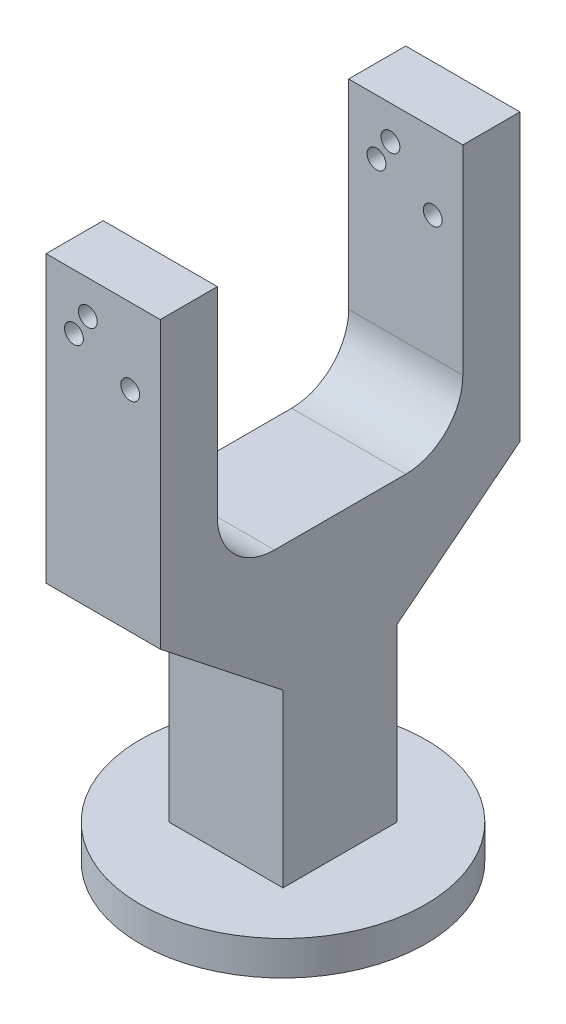
ISO-10303-21;
HEADER;
FILE_DESCRIPTION(('STEP AP214'),'2;1');
FILE_NAME('part.step','',(''),(''),'','','');
FILE_SCHEMA(('AUTOMOTIVE_DESIGN { 1 0 10303 214 1 1 1 1 }'));
ENDSEC;
DATA;
#1=APPLICATION_CONTEXT('core data for automotive mechanical design processes');
#2=APPLICATION_PROTOCOL_DEFINITION('international standard','automotive_design',2000,#1);
#3=PRODUCT_CONTEXT('',#1,'mechanical');
#4=PRODUCT('Part','Part','',(#3));
#5=PRODUCT_RELATED_PRODUCT_CATEGORY('part','',(#4));
#6=PRODUCT_DEFINITION_FORMATION('','',#4);
#7=PRODUCT_DEFINITION_CONTEXT('part definition',#1,'design');
#8=PRODUCT_DEFINITION('design','',#6,#7);
#9=PRODUCT_DEFINITION_SHAPE('','',#8);
#10=(LENGTH_UNIT() NAMED_UNIT(*) SI_UNIT(.MILLI.,.METRE.));
#11=(NAMED_UNIT(*) PLANE_ANGLE_UNIT() SI_UNIT($,.RADIAN.));
#12=(NAMED_UNIT(*) SI_UNIT($,.STERADIAN.) SOLID_ANGLE_UNIT());
#13=UNCERTAINTY_MEASURE_WITH_UNIT(LENGTH_MEASURE(1.E-05),#10,'distance_accuracy_value','');
#14=(GEOMETRIC_REPRESENTATION_CONTEXT(3) GLOBAL_UNCERTAINTY_ASSIGNED_CONTEXT((#13)) GLOBAL_UNIT_ASSIGNED_CONTEXT((#10,
#11,#12)) REPRESENTATION_CONTEXT('',''));
#15=CARTESIAN_POINT('',(0.,0.,0.));
#16=DIRECTION('',(0.,0.,1.));
#17=DIRECTION('',(1.,0.,0.));
#18=AXIS2_PLACEMENT_3D('',#15,#16,#17);
#19=CARTESIAN_POINT('',(0.,6.,0.));
#20=DIRECTION('',(0.,-1.,0.));
#21=DIRECTION('',(0.,0.,-1.));
#22=AXIS2_PLACEMENT_3D('',#19,#20,#21);
#23=CYLINDRICAL_SURFACE('',#22,25.);
#24=CARTESIAN_POINT('',(0.,6.,0.));
#25=DIRECTION('',(0.,1.,0.));
#26=DIRECTION('',(0.,0.,1.));
#27=AXIS2_PLACEMENT_3D('',#24,#25,#26);
#28=CIRCLE('',#27,25.);
#29=CARTESIAN_POINT('',(0.,6.,25.));
#30=VERTEX_POINT('',#29);
#31=EDGE_CURVE('E285',#30,#30,#28,.T.);
#32=ORIENTED_EDGE('',*,*,#31,.F.);
#33=EDGE_LOOP('',(#32));
#34=FACE_BOUND('',#33,.T.);
#35=CARTESIAN_POINT('',(0.,0.,0.));
#36=DIRECTION('',(0.,1.,0.));
#37=DIRECTION('',(0.,0.,1.));
#38=AXIS2_PLACEMENT_3D('',#35,#36,#37);
#39=CIRCLE('',#38,25.);
#40=CARTESIAN_POINT('',(0.,0.,25.));
#41=VERTEX_POINT('',#40);
#42=EDGE_CURVE('E284',#41,#41,#39,.T.);
#43=ORIENTED_EDGE('',*,*,#42,.T.);
#44=EDGE_LOOP('',(#43));
#45=FACE_BOUND('',#44,.T.);
#46=ADVANCED_FACE('F45',(#34,#45),#23,.T.);
#47=CARTESIAN_POINT('',(0.,6.,0.));
#48=DIRECTION('',(0.,1.,0.));
#49=DIRECTION('',(0.,0.,1.));
#50=AXIS2_PLACEMENT_3D('',#47,#48,#49);
#51=PLANE('',#50);
#52=DIRECTION('',(0.,0.,-1.));
#53=VECTOR('',#52,1.);
#54=CARTESIAN_POINT('',(10.,6.,-10.));
#55=LINE('',#54,#53);
#56=CARTESIAN_POINT('',(10.,6.,10.));
#57=VERTEX_POINT('',#56);
#58=CARTESIAN_POINT('',(10.,6.,-10.));
#59=VERTEX_POINT('',#58);
#60=EDGE_CURVE('E243',#57,#59,#55,.T.);
#61=ORIENTED_EDGE('',*,*,#60,.F.);
#62=DIRECTION('',(1.,0.,0.));
#63=VECTOR('',#62,1.);
#64=CARTESIAN_POINT('',(-10.,6.,10.));
#65=LINE('',#64,#63);
#66=CARTESIAN_POINT('',(-10.,6.,10.));
#67=VERTEX_POINT('',#66);
#68=EDGE_CURVE('E152',#67,#57,#65,.T.);
#69=ORIENTED_EDGE('',*,*,#68,.F.);
#70=DIRECTION('',(0.,0.,1.));
#71=VECTOR('',#70,1.);
#72=CARTESIAN_POINT('',(-10.,6.,-10.));
#73=LINE('',#72,#71);
#74=CARTESIAN_POINT('',(-10.,6.,-10.));
#75=VERTEX_POINT('',#74);
#76=EDGE_CURVE('E268',#75,#67,#73,.T.);
#77=ORIENTED_EDGE('',*,*,#76,.F.);
#78=DIRECTION('',(-1.,0.,0.));
#79=VECTOR('',#78,1.);
#80=CARTESIAN_POINT('',(-10.,6.,-10.));
#81=LINE('',#80,#79);
#82=EDGE_CURVE('E264',#59,#75,#81,.T.);
#83=ORIENTED_EDGE('',*,*,#82,.F.);
#84=EDGE_LOOP('',(#61,#69,#77,#83));
#85=FACE_BOUND('',#84,.T.);
#86=ORIENTED_EDGE('',*,*,#31,.T.);
#87=EDGE_LOOP('',(#86));
#88=FACE_BOUND('',#87,.T.);
#89=ADVANCED_FACE('F338',(#85,#88),#51,.T.);
#90=CARTESIAN_POINT('',(0.,0.,0.));
#91=DIRECTION('',(0.,1.,0.));
#92=DIRECTION('',(0.,0.,1.));
#93=AXIS2_PLACEMENT_3D('',#90,#91,#92);
#94=PLANE('',#93);
#95=CARTESIAN_POINT('',(0.,0.,0.));
#96=DIRECTION('',(0.,-1.,0.));
#97=DIRECTION('',(0.,0.,-1.));
#98=AXIS2_PLACEMENT_3D('',#95,#96,#97);
#99=CIRCLE('',#98,11.1);
#100=CARTESIAN_POINT('',(0.,0.,-11.1));
#101=VERTEX_POINT('',#100);
#102=EDGE_CURVE('E184',#101,#101,#99,.T.);
#103=ORIENTED_EDGE('',*,*,#102,.F.);
#104=EDGE_LOOP('',(#103));
#105=FACE_BOUND('',#104,.T.);
#106=ORIENTED_EDGE('',*,*,#42,.F.);
#107=EDGE_LOOP('',(#106));
#108=FACE_BOUND('',#107,.T.);
#109=ADVANCED_FACE('F344',(#105,#108),#94,.F.);
#110=CARTESIAN_POINT('',(10.,36.,-10.));
#111=DIRECTION('',(-1.,0.,0.));
#112=DIRECTION('',(0.,0.,1.));
#113=AXIS2_PLACEMENT_3D('',#110,#111,#112);
#114=PLANE('',#113);
#115=ORIENTED_EDGE('',*,*,#60,.T.);
#116=DIRECTION('',(0.,-1.,0.));
#117=VECTOR('',#116,1.);
#118=CARTESIAN_POINT('',(10.,36.,-10.));
#119=LINE('',#118,#117);
#120=CARTESIAN_POINT('',(10.,36.,-10.));
#121=VERTEX_POINT('',#120);
#122=EDGE_CURVE('E280',#121,#59,#119,.T.);
#123=ORIENTED_EDGE('',*,*,#122,.F.);
#124=DIRECTION('',(0.,-0.619466445273104,0.785023135442965));
#125=VECTOR('',#124,1.);
#126=CARTESIAN_POINT('',(10.,36.,-10.));
#127=LINE('',#126,#125);
#128=CARTESIAN_POINT('',(9.99999999999999,52.9657784236594,-31.5));
#129=VERTEX_POINT('',#128);
#130=EDGE_CURVE('E208',#129,#121,#127,.T.);
#131=ORIENTED_EDGE('',*,*,#130,.F.);
#132=DIRECTION('',(0.,-1.,0.));
#133=VECTOR('',#132,1.);
#134=CARTESIAN_POINT('',(9.99999999999999,52.9657784236594,-31.5));
#135=LINE('',#134,#133);
#136=CARTESIAN_POINT('',(9.99999999999999,102.965778423659,-31.5));
#137=VERTEX_POINT('',#136);
#138=EDGE_CURVE('E204',#137,#129,#135,.T.);
#139=ORIENTED_EDGE('',*,*,#138,.F.);
#140=DIRECTION('',(0.,0.,-1.));
#141=VECTOR('',#140,1.);
#142=CARTESIAN_POINT('',(9.99999999999999,102.965778423659,-31.5));
#143=LINE('',#142,#141);
#144=CARTESIAN_POINT('',(10.,102.965778423659,-21.5));
#145=VERTEX_POINT('',#144);
#146=EDGE_CURVE('E200',#145,#137,#143,.T.);
#147=ORIENTED_EDGE('',*,*,#146,.F.);
#148=DIRECTION('',(0.,1.,0.));
#149=VECTOR('',#148,1.);
#150=CARTESIAN_POINT('',(10.,102.965778423659,-21.5));
#151=LINE('',#150,#149);
#152=CARTESIAN_POINT('',(10.,68.0112471202483,-21.5));
#153=VERTEX_POINT('',#152);
#154=EDGE_CURVE('E197',#153,#145,#151,.T.);
#155=ORIENTED_EDGE('',*,*,#154,.F.);
#156=CARTESIAN_POINT('',(10.,68.0112471202483,-11.5));
#157=DIRECTION('',(-1.,0.,0.));
#158=DIRECTION('',(0.,0.,1.));
#159=AXIS2_PLACEMENT_3D('',#156,#157,#158);
#160=CIRCLE('',#159,10.);
#161=CARTESIAN_POINT('',(10.,58.0112471202483,-11.5));
#162=VERTEX_POINT('',#161);
#163=EDGE_CURVE('E302',#153,#162,#160,.T.);
#164=ORIENTED_EDGE('',*,*,#163,.T.);
#165=DIRECTION('',(0.,0.,-1.));
#166=VECTOR('',#165,1.);
#167=CARTESIAN_POINT('',(10.,58.0112471202483,-21.5));
#168=LINE('',#167,#166);
#169=CARTESIAN_POINT('',(10.,58.0112471202483,11.5));
#170=VERTEX_POINT('',#169);
#171=EDGE_CURVE('E194',#170,#162,#168,.T.);
#172=ORIENTED_EDGE('',*,*,#171,.F.);
#173=CARTESIAN_POINT('',(10.,68.0112471202483,11.5));
#174=DIRECTION('',(-1.,0.,0.));
#175=DIRECTION('',(0.,0.,1.));
#176=AXIS2_PLACEMENT_3D('',#173,#174,#175);
#177=CIRCLE('',#176,10.);
#178=CARTESIAN_POINT('',(10.,68.0112471202483,21.5));
#179=VERTEX_POINT('',#178);
#180=EDGE_CURVE('E11',#170,#179,#177,.T.);
#181=ORIENTED_EDGE('',*,*,#180,.T.);
#182=DIRECTION('',(0.,-1.,0.));
#183=VECTOR('',#182,1.);
#184=CARTESIAN_POINT('',(10.,102.965778423659,21.5));
#185=LINE('',#184,#183);
#186=CARTESIAN_POINT('',(10.,102.965778423659,21.5));
#187=VERTEX_POINT('',#186);
#188=EDGE_CURVE('E190',#187,#179,#185,.T.);
#189=ORIENTED_EDGE('',*,*,#188,.F.);
#190=DIRECTION('',(0.,0.,-1.));
#191=VECTOR('',#190,1.);
#192=CARTESIAN_POINT('',(10.,102.965778423659,21.5));
#193=LINE('',#192,#191);
#194=CARTESIAN_POINT('',(10.,102.965778423659,31.5));
#195=VERTEX_POINT('',#194);
#196=EDGE_CURVE('E178',#195,#187,#193,.T.);
#197=ORIENTED_EDGE('',*,*,#196,.F.);
#198=DIRECTION('',(0.,1.,0.));
#199=VECTOR('',#198,1.);
#200=CARTESIAN_POINT('',(10.,102.965778423659,31.5));
#201=LINE('',#200,#199);
#202=CARTESIAN_POINT('',(10.,52.9657784236594,31.5));
#203=VERTEX_POINT('',#202);
#204=EDGE_CURVE('E172',#203,#195,#201,.T.);
#205=ORIENTED_EDGE('',*,*,#204,.F.);
#206=DIRECTION('',(0.,0.619466445273104,0.785023135442965));
#207=VECTOR('',#206,1.);
#208=CARTESIAN_POINT('',(10.,52.9657784236594,31.5));
#209=LINE('',#208,#207);
#210=CARTESIAN_POINT('',(10.,36.,9.99999999999999));
#211=VERTEX_POINT('',#210);
#212=EDGE_CURVE('E162',#211,#203,#209,.T.);
#213=ORIENTED_EDGE('',*,*,#212,.F.);
#214=DIRECTION('',(0.,-1.,0.));
#215=VECTOR('',#214,1.);
#216=CARTESIAN_POINT('',(10.,36.,10.));
#217=LINE('',#216,#215);
#218=EDGE_CURVE('E146',#211,#57,#217,.T.);
#219=ORIENTED_EDGE('',*,*,#218,.T.);
#220=EDGE_LOOP('',(#115,#123,#131,#139,#147,#155,#164,#172,#181,#189,#197,#205,#213,#219));
#221=FACE_BOUND('',#220,.T.);
#222=ADVANCED_FACE('F169',(#221),#114,.F.);
#223=CARTESIAN_POINT('',(-10.,36.,-10.));
#224=DIRECTION('',(0.,0.,1.));
#225=DIRECTION('',(1.,0.,0.));
#226=AXIS2_PLACEMENT_3D('',#223,#224,#225);
#227=PLANE('',#226);
#228=ORIENTED_EDGE('',*,*,#82,.T.);
#229=DIRECTION('',(0.,-1.,0.));
#230=VECTOR('',#229,1.);
#231=CARTESIAN_POINT('',(-10.,36.,-10.));
#232=LINE('',#231,#230);
#233=CARTESIAN_POINT('',(-10.,36.,-10.));
#234=VERTEX_POINT('',#233);
#235=EDGE_CURVE('E276',#234,#75,#232,.T.);
#236=ORIENTED_EDGE('',*,*,#235,.F.);
#237=DIRECTION('',(-1.,0.,0.));
#238=VECTOR('',#237,1.);
#239=CARTESIAN_POINT('',(-10.,36.,-10.));
#240=LINE('',#239,#238);
#241=EDGE_CURVE('E166',#121,#234,#240,.T.);
#242=ORIENTED_EDGE('',*,*,#241,.F.);
#243=ORIENTED_EDGE('',*,*,#122,.T.);
#244=EDGE_LOOP('',(#228,#236,#242,#243));
#245=FACE_BOUND('',#244,.T.);
#246=ADVANCED_FACE('F354',(#245),#227,.F.);
#247=CARTESIAN_POINT('',(-10.,36.,-10.));
#248=DIRECTION('',(1.,0.,0.));
#249=DIRECTION('',(0.,0.,-1.));
#250=AXIS2_PLACEMENT_3D('',#247,#248,#249);
#251=PLANE('',#250);
#252=ORIENTED_EDGE('',*,*,#76,.T.);
#253=DIRECTION('',(0.,-1.,0.));
#254=VECTOR('',#253,1.);
#255=CARTESIAN_POINT('',(-10.,36.,10.));
#256=LINE('',#255,#254);
#257=CARTESIAN_POINT('',(-10.,36.,10.));
#258=VERTEX_POINT('',#257);
#259=EDGE_CURVE('E157',#258,#67,#256,.T.);
#260=ORIENTED_EDGE('',*,*,#259,.F.);
#261=DIRECTION('',(0.,0.619466445273104,0.785023135442965));
#262=VECTOR('',#261,1.);
#263=CARTESIAN_POINT('',(-9.99999999999999,52.9657784236594,31.5));
#264=LINE('',#263,#262);
#265=CARTESIAN_POINT('',(-9.99999999999999,52.9657784236594,31.5));
#266=VERTEX_POINT('',#265);
#267=EDGE_CURVE('E164',#258,#266,#264,.T.);
#268=ORIENTED_EDGE('',*,*,#267,.T.);
#269=DIRECTION('',(0.,1.,0.));
#270=VECTOR('',#269,1.);
#271=CARTESIAN_POINT('',(-9.99999999999999,102.965778423659,31.5));
#272=LINE('',#271,#270);
#273=CARTESIAN_POINT('',(-9.99999999999999,102.965778423659,31.5));
#274=VERTEX_POINT('',#273);
#275=EDGE_CURVE('E215',#266,#274,#272,.T.);
#276=ORIENTED_EDGE('',*,*,#275,.T.);
#277=DIRECTION('',(0.,0.,-1.));
#278=VECTOR('',#277,1.);
#279=CARTESIAN_POINT('',(-10.,102.965778423659,21.5));
#280=LINE('',#279,#278);
#281=CARTESIAN_POINT('',(-10.,102.965778423659,21.5));
#282=VERTEX_POINT('',#281);
#283=EDGE_CURVE('E220',#274,#282,#280,.T.);
#284=ORIENTED_EDGE('',*,*,#283,.T.);
#285=DIRECTION('',(0.,-1.,0.));
#286=VECTOR('',#285,1.);
#287=CARTESIAN_POINT('',(-10.,102.965778423659,21.5));
#288=LINE('',#287,#286);
#289=CARTESIAN_POINT('',(-10.,68.0112471202483,21.5));
#290=VERTEX_POINT('',#289);
#291=EDGE_CURVE('E224',#282,#290,#288,.T.);
#292=ORIENTED_EDGE('',*,*,#291,.T.);
#293=CARTESIAN_POINT('',(-10.,68.0112471202483,11.5));
#294=DIRECTION('',(1.,0.,0.));
#295=DIRECTION('',(0.,0.,-1.));
#296=AXIS2_PLACEMENT_3D('',#293,#294,#295);
#297=CIRCLE('',#296,10.);
#298=CARTESIAN_POINT('',(-10.,58.0112471202483,11.5));
#299=VERTEX_POINT('',#298);
#300=EDGE_CURVE('E54',#290,#299,#297,.T.);
#301=ORIENTED_EDGE('',*,*,#300,.T.);
#302=DIRECTION('',(0.,0.,-1.));
#303=VECTOR('',#302,1.);
#304=CARTESIAN_POINT('',(-10.,58.0112471202483,-21.5));
#305=LINE('',#304,#303);
#306=CARTESIAN_POINT('',(-10.,58.0112471202483,-11.5));
#307=VERTEX_POINT('',#306);
#308=EDGE_CURVE('E227',#299,#307,#305,.T.);
#309=ORIENTED_EDGE('',*,*,#308,.T.);
#310=CARTESIAN_POINT('',(-10.,68.0112471202483,-11.5));
#311=DIRECTION('',(1.,0.,0.));
#312=DIRECTION('',(0.,0.,-1.));
#313=AXIS2_PLACEMENT_3D('',#310,#311,#312);
#314=CIRCLE('',#313,10.);
#315=CARTESIAN_POINT('',(-10.,68.0112471202483,-21.5));
#316=VERTEX_POINT('',#315);
#317=EDGE_CURVE('E299',#307,#316,#314,.T.);
#318=ORIENTED_EDGE('',*,*,#317,.T.);
#319=DIRECTION('',(0.,1.,0.));
#320=VECTOR('',#319,1.);
#321=CARTESIAN_POINT('',(-10.,102.965778423659,-21.5));
#322=LINE('',#321,#320);
#323=CARTESIAN_POINT('',(-10.,102.965778423659,-21.5));
#324=VERTEX_POINT('',#323);
#325=EDGE_CURVE('E230',#316,#324,#322,.T.);
#326=ORIENTED_EDGE('',*,*,#325,.T.);
#327=DIRECTION('',(0.,0.,-1.));
#328=VECTOR('',#327,1.);
#329=CARTESIAN_POINT('',(-10.,102.965778423659,-31.5));
#330=LINE('',#329,#328);
#331=CARTESIAN_POINT('',(-10.,102.965778423659,-31.5));
#332=VERTEX_POINT('',#331);
#333=EDGE_CURVE('E233',#324,#332,#330,.T.);
#334=ORIENTED_EDGE('',*,*,#333,.T.);
#335=DIRECTION('',(0.,-1.,0.));
#336=VECTOR('',#335,1.);
#337=CARTESIAN_POINT('',(-10.,52.9657784236594,-31.5));
#338=LINE('',#337,#336);
#339=CARTESIAN_POINT('',(-10.,52.9657784236594,-31.5));
#340=VERTEX_POINT('',#339);
#341=EDGE_CURVE('E181',#332,#340,#338,.T.);
#342=ORIENTED_EDGE('',*,*,#341,.T.);
#343=DIRECTION('',(0.,-0.619466445273104,0.785023135442965));
#344=VECTOR('',#343,1.);
#345=CARTESIAN_POINT('',(-10.,36.,-10.));
#346=LINE('',#345,#344);
#347=EDGE_CURVE('E174',#340,#234,#346,.T.);
#348=ORIENTED_EDGE('',*,*,#347,.T.);
#349=ORIENTED_EDGE('',*,*,#235,.T.);
#350=EDGE_LOOP('',(#252,#260,#268,#276,#284,#292,#301,#309,#318,#326,#334,#342,#348,#349));
#351=FACE_BOUND('',#350,.T.);
#352=ADVANCED_FACE('F319',(#351),#251,.F.);
#353=CARTESIAN_POINT('',(-10.,36.,10.));
#354=DIRECTION('',(0.,0.,-1.));
#355=DIRECTION('',(-1.,0.,0.));
#356=AXIS2_PLACEMENT_3D('',#353,#354,#355);
#357=PLANE('',#356);
#358=ORIENTED_EDGE('',*,*,#68,.T.);
#359=ORIENTED_EDGE('',*,*,#218,.F.);
#360=DIRECTION('',(1.,0.,0.));
#361=VECTOR('',#360,1.);
#362=CARTESIAN_POINT('',(-10.,36.,10.));
#363=LINE('',#362,#361);
#364=EDGE_CURVE('E150',#258,#211,#363,.T.);
#365=ORIENTED_EDGE('',*,*,#364,.F.);
#366=ORIENTED_EDGE('',*,*,#259,.T.);
#367=EDGE_LOOP('',(#358,#359,#365,#366));
#368=FACE_BOUND('',#367,.T.);
#369=ADVANCED_FACE('F148',(#368),#357,.F.);
#370=CARTESIAN_POINT('',(10.,36.,-10.));
#371=DIRECTION('',(0.,-0.785023135442965,-0.619466445273104));
#372=DIRECTION('',(0.,0.619466445273104,-0.785023135442965));
#373=AXIS2_PLACEMENT_3D('',#370,#371,#372);
#374=PLANE('',#373);
#375=ORIENTED_EDGE('',*,*,#347,.F.);
#376=DIRECTION('',(-1.,0.,0.));
#377=VECTOR('',#376,1.);
#378=CARTESIAN_POINT('',(9.99999999999999,52.9657784236594,-31.5));
#379=LINE('',#378,#377);
#380=EDGE_CURVE('E240',#129,#340,#379,.T.);
#381=ORIENTED_EDGE('',*,*,#380,.F.);
#382=ORIENTED_EDGE('',*,*,#130,.T.);
#383=ORIENTED_EDGE('',*,*,#241,.T.);
#384=EDGE_LOOP('',(#375,#381,#382,#383));
#385=FACE_BOUND('',#384,.T.);
#386=ADVANCED_FACE('F362',(#385),#374,.T.);
#387=CARTESIAN_POINT('',(9.99999999999999,52.9657784236594,-31.5));
#388=DIRECTION('',(0.,0.,-1.));
#389=DIRECTION('',(-1.,0.,0.));
#390=AXIS2_PLACEMENT_3D('',#387,#388,#389);
#391=PLANE('',#390);
#392=CARTESIAN_POINT('',(4.73493919750901,89.6848751874136,-31.5));
#393=DIRECTION('',(0.,0.,-1.));
#394=DIRECTION('',(-1.,0.,0.));
#395=AXIS2_PLACEMENT_3D('',#392,#393,#394);
#396=CIRCLE('',#395,1.65);
#397=CARTESIAN_POINT('',(3.08493919750901,89.6848751874136,-31.5));
#398=VERTEX_POINT('',#397);
#399=EDGE_CURVE('E423',#398,#398,#396,.T.);
#400=ORIENTED_EDGE('',*,*,#399,.F.);
#401=EDGE_LOOP('',(#400));
#402=FACE_BOUND('',#401,.T.);
#403=CARTESIAN_POINT('',(-2.68261093713792,97.1024253220605,-31.5));
#404=DIRECTION('',(0.,0.,-1.));
#405=DIRECTION('',(-1.,0.,0.));
#406=AXIS2_PLACEMENT_3D('',#403,#404,#405);
#407=CIRCLE('',#406,1.65);
#408=CARTESIAN_POINT('',(-4.33261093713792,97.1024253220605,-31.5));
#409=VERTEX_POINT('',#408);
#410=EDGE_CURVE('E433',#409,#409,#407,.T.);
#411=ORIENTED_EDGE('',*,*,#410,.F.);
#412=EDGE_LOOP('',(#411));
#413=FACE_BOUND('',#412,.T.);
#414=CARTESIAN_POINT('',(-5.12243639453519,93.2726664908998,-31.5));
#415=DIRECTION('',(0.,0.,-1.));
#416=DIRECTION('',(-1.,0.,0.));
#417=AXIS2_PLACEMENT_3D('',#414,#415,#416);
#418=CIRCLE('',#417,1.65000000000001);
#419=CARTESIAN_POINT('',(-6.77243639453521,93.2726664908998,-31.5));
#420=VERTEX_POINT('',#419);
#421=EDGE_CURVE('E456',#420,#420,#418,.T.);
#422=ORIENTED_EDGE('',*,*,#421,.F.);
#423=EDGE_LOOP('',(#422));
#424=FACE_BOUND('',#423,.T.);
#425=ORIENTED_EDGE('',*,*,#341,.F.);
#426=DIRECTION('',(-1.,0.,0.));
#427=VECTOR('',#426,1.);
#428=CARTESIAN_POINT('',(9.99999999999999,102.965778423659,-31.5));
#429=LINE('',#428,#427);
#430=EDGE_CURVE('E244',#137,#332,#429,.T.);
#431=ORIENTED_EDGE('',*,*,#430,.F.);
#432=ORIENTED_EDGE('',*,*,#138,.T.);
#433=ORIENTED_EDGE('',*,*,#380,.T.);
#434=EDGE_LOOP('',(#425,#431,#432,#433));
#435=FACE_BOUND('',#434,.T.);
#436=ADVANCED_FACE('F383',(#402,#413,#424,#435),#391,.T.);
#437=CARTESIAN_POINT('',(9.99999999999999,102.965778423659,-31.5));
#438=DIRECTION('',(0.,1.,0.));
#439=DIRECTION('',(0.,0.,1.));
#440=AXIS2_PLACEMENT_3D('',#437,#438,#439);
#441=PLANE('',#440);
#442=ORIENTED_EDGE('',*,*,#333,.F.);
#443=DIRECTION('',(-1.,0.,0.));
#444=VECTOR('',#443,1.);
#445=CARTESIAN_POINT('',(10.,102.965778423659,-21.5));
#446=LINE('',#445,#444);
#447=EDGE_CURVE('E247',#145,#324,#446,.T.);
#448=ORIENTED_EDGE('',*,*,#447,.F.);
#449=ORIENTED_EDGE('',*,*,#146,.T.);
#450=ORIENTED_EDGE('',*,*,#430,.T.);
#451=EDGE_LOOP('',(#442,#448,#449,#450));
#452=FACE_BOUND('',#451,.T.);
#453=ADVANCED_FACE('F379',(#452),#441,.T.);
#454=CARTESIAN_POINT('',(10.,102.965778423659,-21.5));
#455=DIRECTION('',(0.,0.,1.));
#456=DIRECTION('',(1.,0.,0.));
#457=AXIS2_PLACEMENT_3D('',#454,#455,#456);
#458=PLANE('',#457);
#459=CARTESIAN_POINT('',(4.73493919750901,89.6848751874136,-21.5));
#460=DIRECTION('',(0.,0.,1.));
#461=DIRECTION('',(1.,0.,0.));
#462=AXIS2_PLACEMENT_3D('',#459,#460,#461);
#463=CIRCLE('',#462,1.65);
#464=CARTESIAN_POINT('',(6.38493919750901,89.6848751874136,-21.5));
#465=VERTEX_POINT('',#464);
#466=EDGE_CURVE('E426',#465,#465,#463,.T.);
#467=ORIENTED_EDGE('',*,*,#466,.F.);
#468=EDGE_LOOP('',(#467));
#469=FACE_BOUND('',#468,.T.);
#470=CARTESIAN_POINT('',(-2.68261093713792,97.1024253220605,-21.5));
#471=DIRECTION('',(0.,0.,1.));
#472=DIRECTION('',(1.,0.,0.));
#473=AXIS2_PLACEMENT_3D('',#470,#471,#472);
#474=CIRCLE('',#473,1.65);
#475=CARTESIAN_POINT('',(-1.03261093713792,97.1024253220605,-21.5));
#476=VERTEX_POINT('',#475);
#477=EDGE_CURVE('E448',#476,#476,#474,.T.);
#478=ORIENTED_EDGE('',*,*,#477,.F.);
#479=EDGE_LOOP('',(#478));
#480=FACE_BOUND('',#479,.T.);
#481=CARTESIAN_POINT('',(-5.12243639453519,93.2726664908998,-21.5));
#482=DIRECTION('',(0.,0.,1.));
#483=DIRECTION('',(1.,0.,0.));
#484=AXIS2_PLACEMENT_3D('',#481,#482,#483);
#485=CIRCLE('',#484,1.65000000000001);
#486=CARTESIAN_POINT('',(-3.47243639453518,93.2726664908998,-21.5));
#487=VERTEX_POINT('',#486);
#488=EDGE_CURVE('E460',#487,#487,#485,.T.);
#489=ORIENTED_EDGE('',*,*,#488,.F.);
#490=EDGE_LOOP('',(#489));
#491=FACE_BOUND('',#490,.T.);
#492=ORIENTED_EDGE('',*,*,#325,.F.);
#493=DIRECTION('',(-1.,0.,0.));
#494=VECTOR('',#493,1.);
#495=CARTESIAN_POINT('',(10.,68.0112471202483,-21.5));
#496=LINE('',#495,#494);
#497=EDGE_CURVE('E296',#316,#153,#496,.F.);
#498=ORIENTED_EDGE('',*,*,#497,.T.);
#499=ORIENTED_EDGE('',*,*,#154,.T.);
#500=ORIENTED_EDGE('',*,*,#447,.T.);
#501=EDGE_LOOP('',(#492,#498,#499,#500));
#502=FACE_BOUND('',#501,.T.);
#503=ADVANCED_FACE('F376',(#469,#480,#491,#502),#458,.T.);
#504=CARTESIAN_POINT('',(10.,58.0112471202483,-21.5));
#505=DIRECTION('',(0.,1.,0.));
#506=DIRECTION('',(0.,0.,1.));
#507=AXIS2_PLACEMENT_3D('',#504,#505,#506);
#508=PLANE('',#507);
#509=ORIENTED_EDGE('',*,*,#308,.F.);
#510=DIRECTION('',(-1.,0.,0.));
#511=VECTOR('',#510,1.);
#512=CARTESIAN_POINT('',(10.,58.0112471202483,11.5));
#513=LINE('',#512,#511);
#514=EDGE_CURVE('E67',#299,#170,#513,.F.);
#515=ORIENTED_EDGE('',*,*,#514,.T.);
#516=ORIENTED_EDGE('',*,*,#171,.T.);
#517=DIRECTION('',(-1.,0.,0.));
#518=VECTOR('',#517,1.);
#519=CARTESIAN_POINT('',(-10.,58.0112471202483,-11.5));
#520=LINE('',#519,#518);
#521=EDGE_CURVE('E289',#162,#307,#520,.T.);
#522=ORIENTED_EDGE('',*,*,#521,.T.);
#523=EDGE_LOOP('',(#509,#515,#516,#522));
#524=FACE_BOUND('',#523,.T.);
#525=ADVANCED_FACE('F373',(#524),#508,.T.);
#526=CARTESIAN_POINT('',(10.,102.965778423659,21.5));
#527=DIRECTION('',(0.,0.,-1.));
#528=DIRECTION('',(-1.,0.,0.));
#529=AXIS2_PLACEMENT_3D('',#526,#527,#528);
#530=PLANE('',#529);
#531=CARTESIAN_POINT('',(4.73493919750901,89.6848751874136,21.5));
#532=DIRECTION('',(0.,0.,-1.));
#533=DIRECTION('',(-1.,0.,0.));
#534=AXIS2_PLACEMENT_3D('',#531,#532,#533);
#535=CIRCLE('',#534,1.65);
#536=CARTESIAN_POINT('',(3.08493919750901,89.6848751874136,21.5));
#537=VERTEX_POINT('',#536);
#538=EDGE_CURVE('E428',#537,#537,#535,.T.);
#539=ORIENTED_EDGE('',*,*,#538,.F.);
#540=EDGE_LOOP('',(#539));
#541=FACE_BOUND('',#540,.T.);
#542=CARTESIAN_POINT('',(-2.68261093713792,97.1024253220605,21.5));
#543=DIRECTION('',(0.,0.,-1.));
#544=DIRECTION('',(-1.,0.,0.));
#545=AXIS2_PLACEMENT_3D('',#542,#543,#544);
#546=CIRCLE('',#545,1.65);
#547=CARTESIAN_POINT('',(-4.33261093713792,97.1024253220605,21.5));
#548=VERTEX_POINT('',#547);
#549=EDGE_CURVE('E452',#548,#548,#546,.T.);
#550=ORIENTED_EDGE('',*,*,#549,.F.);
#551=EDGE_LOOP('',(#550));
#552=FACE_BOUND('',#551,.T.);
#553=CARTESIAN_POINT('',(-5.12243639453519,93.2726664908998,21.5));
#554=DIRECTION('',(0.,0.,-1.));
#555=DIRECTION('',(-1.,0.,0.));
#556=AXIS2_PLACEMENT_3D('',#553,#554,#555);
#557=CIRCLE('',#556,1.65000000000001);
#558=CARTESIAN_POINT('',(-6.77243639453521,93.2726664908998,21.5));
#559=VERTEX_POINT('',#558);
#560=EDGE_CURVE('E464',#559,#559,#557,.T.);
#561=ORIENTED_EDGE('',*,*,#560,.F.);
#562=EDGE_LOOP('',(#561));
#563=FACE_BOUND('',#562,.T.);
#564=ORIENTED_EDGE('',*,*,#188,.T.);
#565=DIRECTION('',(-1.,0.,0.));
#566=VECTOR('',#565,1.);
#567=CARTESIAN_POINT('',(-10.,68.0112471202483,21.5));
#568=LINE('',#567,#566);
#569=EDGE_CURVE('E306',#179,#290,#568,.T.);
#570=ORIENTED_EDGE('',*,*,#569,.T.);
#571=ORIENTED_EDGE('',*,*,#291,.F.);
#572=DIRECTION('',(-1.,0.,0.));
#573=VECTOR('',#572,1.);
#574=CARTESIAN_POINT('',(10.,102.965778423659,21.5));
#575=LINE('',#574,#573);
#576=EDGE_CURVE('E251',#187,#282,#575,.T.);
#577=ORIENTED_EDGE('',*,*,#576,.F.);
#578=EDGE_LOOP('',(#564,#570,#571,#577));
#579=FACE_BOUND('',#578,.T.);
#580=ADVANCED_FACE('F315',(#541,#552,#563,#579),#530,.T.);
#581=CARTESIAN_POINT('',(10.,102.965778423659,21.5));
#582=DIRECTION('',(0.,1.,0.));
#583=DIRECTION('',(0.,0.,1.));
#584=AXIS2_PLACEMENT_3D('',#581,#582,#583);
#585=PLANE('',#584);
#586=ORIENTED_EDGE('',*,*,#283,.F.);
#587=DIRECTION('',(-1.,0.,0.));
#588=VECTOR('',#587,1.);
#589=CARTESIAN_POINT('',(10.,102.965778423659,31.5));
#590=LINE('',#589,#588);
#591=EDGE_CURVE('E254',#195,#274,#590,.T.);
#592=ORIENTED_EDGE('',*,*,#591,.F.);
#593=ORIENTED_EDGE('',*,*,#196,.T.);
#594=ORIENTED_EDGE('',*,*,#576,.T.);
#595=EDGE_LOOP('',(#586,#592,#593,#594));
#596=FACE_BOUND('',#595,.T.);
#597=ADVANCED_FACE('F323',(#596),#585,.T.);
#598=CARTESIAN_POINT('',(10.,102.965778423659,31.5));
#599=DIRECTION('',(0.,0.,1.));
#600=DIRECTION('',(1.,0.,0.));
#601=AXIS2_PLACEMENT_3D('',#598,#599,#600);
#602=PLANE('',#601);
#603=CARTESIAN_POINT('',(4.73493919750901,89.6848751874136,31.5));
#604=DIRECTION('',(0.,0.,1.));
#605=DIRECTION('',(1.,0.,0.));
#606=AXIS2_PLACEMENT_3D('',#603,#604,#605);
#607=CIRCLE('',#606,1.65);
#608=CARTESIAN_POINT('',(6.38493919750901,89.6848751874136,31.5));
#609=VERTEX_POINT('',#608);
#610=EDGE_CURVE('E468',#609,#609,#607,.T.);
#611=ORIENTED_EDGE('',*,*,#610,.F.);
#612=EDGE_LOOP('',(#611));
#613=FACE_BOUND('',#612,.T.);
#614=CARTESIAN_POINT('',(-2.68261093713792,97.1024253220605,31.5));
#615=DIRECTION('',(0.,0.,1.));
#616=DIRECTION('',(1.,0.,0.));
#617=AXIS2_PLACEMENT_3D('',#614,#615,#616);
#618=CIRCLE('',#617,1.65);
#619=CARTESIAN_POINT('',(-1.03261093713792,97.1024253220605,31.5));
#620=VERTEX_POINT('',#619);
#621=EDGE_CURVE('E473',#620,#620,#618,.T.);
#622=ORIENTED_EDGE('',*,*,#621,.F.);
#623=EDGE_LOOP('',(#622));
#624=FACE_BOUND('',#623,.T.);
#625=CARTESIAN_POINT('',(-5.12243639453519,93.2726664908998,31.5));
#626=DIRECTION('',(0.,0.,1.));
#627=DIRECTION('',(1.,0.,0.));
#628=AXIS2_PLACEMENT_3D('',#625,#626,#627);
#629=CIRCLE('',#628,1.65000000000001);
#630=CARTESIAN_POINT('',(-3.47243639453518,93.2726664908998,31.5));
#631=VERTEX_POINT('',#630);
#632=EDGE_CURVE('E469',#631,#631,#629,.T.);
#633=ORIENTED_EDGE('',*,*,#632,.F.);
#634=EDGE_LOOP('',(#633));
#635=FACE_BOUND('',#634,.T.);
#636=ORIENTED_EDGE('',*,*,#275,.F.);
#637=DIRECTION('',(-1.,0.,0.));
#638=VECTOR('',#637,1.);
#639=CARTESIAN_POINT('',(10.,52.9657784236594,31.5));
#640=LINE('',#639,#638);
#641=EDGE_CURVE('E212',#203,#266,#640,.T.);
#642=ORIENTED_EDGE('',*,*,#641,.F.);
#643=ORIENTED_EDGE('',*,*,#204,.T.);
#644=ORIENTED_EDGE('',*,*,#591,.T.);
#645=EDGE_LOOP('',(#636,#642,#643,#644));
#646=FACE_BOUND('',#645,.T.);
#647=ADVANCED_FACE('F365',(#613,#624,#635,#646),#602,.T.);
#648=CARTESIAN_POINT('',(10.,52.9657784236594,31.5));
#649=DIRECTION('',(0.,-0.785023135442965,0.619466445273105));
#650=DIRECTION('',(0.,-0.619466445273105,-0.785023135442965));
#651=AXIS2_PLACEMENT_3D('',#648,#649,#650);
#652=PLANE('',#651);
#653=ORIENTED_EDGE('',*,*,#267,.F.);
#654=ORIENTED_EDGE('',*,*,#364,.T.);
#655=ORIENTED_EDGE('',*,*,#212,.T.);
#656=ORIENTED_EDGE('',*,*,#641,.T.);
#657=EDGE_LOOP('',(#653,#654,#655,#656));
#658=FACE_BOUND('',#657,.T.);
#659=ADVANCED_FACE('F161',(#658),#652,.T.);
#660=CARTESIAN_POINT('',(10.,68.0112471202483,-11.5));
#661=DIRECTION('',(1.,0.,0.));
#662=DIRECTION('',(0.,0.,-1.));
#663=AXIS2_PLACEMENT_3D('',#660,#661,#662);
#664=CYLINDRICAL_SURFACE('',#663,10.);
#665=ORIENTED_EDGE('',*,*,#163,.F.);
#666=ORIENTED_EDGE('',*,*,#497,.F.);
#667=ORIENTED_EDGE('',*,*,#317,.F.);
#668=ORIENTED_EDGE('',*,*,#521,.F.);
#669=EDGE_LOOP('',(#665,#666,#667,#668));
#670=FACE_BOUND('',#669,.T.);
#671=ADVANCED_FACE('F326',(#670),#664,.F.);
#672=CARTESIAN_POINT('',(10.,68.0112471202483,11.5));
#673=DIRECTION('',(1.,0.,0.));
#674=DIRECTION('',(0.,0.,-1.));
#675=AXIS2_PLACEMENT_3D('',#672,#673,#674);
#676=CYLINDRICAL_SURFACE('',#675,10.);
#677=ORIENTED_EDGE('',*,*,#180,.F.);
#678=ORIENTED_EDGE('',*,*,#514,.F.);
#679=ORIENTED_EDGE('',*,*,#300,.F.);
#680=ORIENTED_EDGE('',*,*,#569,.F.);
#681=EDGE_LOOP('',(#677,#678,#679,#680));
#682=FACE_BOUND('',#681,.T.);
#683=ADVANCED_FACE('F47',(#682),#676,.F.);
#684=CARTESIAN_POINT('',(0.,2.2,0.));
#685=DIRECTION('',(0.,-1.,0.));
#686=DIRECTION('',(0.,0.,-1.));
#687=AXIS2_PLACEMENT_3D('',#684,#685,#686);
#688=CYLINDRICAL_SURFACE('',#687,11.1);
#689=CARTESIAN_POINT('',(0.,2.2,0.));
#690=DIRECTION('',(0.,-1.,0.));
#691=DIRECTION('',(0.,0.,-1.));
#692=AXIS2_PLACEMENT_3D('',#689,#690,#691);
#693=CIRCLE('',#692,11.1);
#694=CARTESIAN_POINT('',(0.,2.2,-11.1));
#695=VERTEX_POINT('',#694);
#696=EDGE_CURVE('E216',#695,#695,#693,.T.);
#697=ORIENTED_EDGE('',*,*,#696,.F.);
#698=EDGE_LOOP('',(#697));
#699=FACE_BOUND('',#698,.T.);
#700=ORIENTED_EDGE('',*,*,#102,.T.);
#701=EDGE_LOOP('',(#700));
#702=FACE_BOUND('',#701,.T.);
#703=ADVANCED_FACE('F325',(#699,#702),#688,.F.);
#704=CARTESIAN_POINT('',(0.,2.2,0.));
#705=DIRECTION('',(0.,-1.,0.));
#706=DIRECTION('',(0.,0.,-1.));
#707=AXIS2_PLACEMENT_3D('',#704,#705,#706);
#708=PLANE('',#707);
#709=ORIENTED_EDGE('',*,*,#696,.T.);
#710=EDGE_LOOP('',(#709));
#711=FACE_BOUND('',#710,.T.);
#712=ADVANCED_FACE('F332',(#711),#708,.T.);
#713=CARTESIAN_POINT('',(-5.12243639453519,93.2726664908998,-48.5));
#714=DIRECTION('',(0.,0.,1.));
#715=DIRECTION('',(1.,0.,0.));
#716=AXIS2_PLACEMENT_3D('',#713,#714,#715);
#717=CYLINDRICAL_SURFACE('',#716,1.65000000000001);
#718=ORIENTED_EDGE('',*,*,#560,.T.);
#719=EDGE_LOOP('',(#718));
#720=FACE_BOUND('',#719,.T.);
#721=ORIENTED_EDGE('',*,*,#632,.T.);
#722=EDGE_LOOP('',(#721));
#723=FACE_BOUND('',#722,.T.);
#724=ADVANCED_FACE('F393',(#720,#723),#717,.F.);
#725=CARTESIAN_POINT('',(-2.68261093713792,97.1024253220605,-48.5));
#726=DIRECTION('',(0.,0.,1.));
#727=DIRECTION('',(1.,0.,0.));
#728=AXIS2_PLACEMENT_3D('',#725,#726,#727);
#729=CYLINDRICAL_SURFACE('',#728,1.65);
#730=ORIENTED_EDGE('',*,*,#549,.T.);
#731=EDGE_LOOP('',(#730));
#732=FACE_BOUND('',#731,.T.);
#733=ORIENTED_EDGE('',*,*,#621,.T.);
#734=EDGE_LOOP('',(#733));
#735=FACE_BOUND('',#734,.T.);
#736=ADVANCED_FACE('F397',(#732,#735),#729,.F.);
#737=CARTESIAN_POINT('',(4.73493919750901,89.6848751874136,-48.5));
#738=DIRECTION('',(0.,0.,1.));
#739=DIRECTION('',(1.,0.,0.));
#740=AXIS2_PLACEMENT_3D('',#737,#738,#739);
#741=CYLINDRICAL_SURFACE('',#740,1.65);
#742=ORIENTED_EDGE('',*,*,#538,.T.);
#743=EDGE_LOOP('',(#742));
#744=FACE_BOUND('',#743,.T.);
#745=ORIENTED_EDGE('',*,*,#610,.T.);
#746=EDGE_LOOP('',(#745));
#747=FACE_BOUND('',#746,.T.);
#748=ADVANCED_FACE('F402',(#744,#747),#741,.F.);
#749=ORIENTED_EDGE('',*,*,#421,.T.);
#750=EDGE_LOOP('',(#749));
#751=FACE_BOUND('',#750,.T.);
#752=ORIENTED_EDGE('',*,*,#488,.T.);
#753=EDGE_LOOP('',(#752));
#754=FACE_BOUND('',#753,.T.);
#755=ADVANCED_FACE('F399',(#751,#754),#717,.F.);
#756=ORIENTED_EDGE('',*,*,#410,.T.);
#757=EDGE_LOOP('',(#756));
#758=FACE_BOUND('',#757,.T.);
#759=ORIENTED_EDGE('',*,*,#477,.T.);
#760=EDGE_LOOP('',(#759));
#761=FACE_BOUND('',#760,.T.);
#762=ADVANCED_FACE('F404',(#758,#761),#729,.F.);
#763=ORIENTED_EDGE('',*,*,#399,.T.);
#764=EDGE_LOOP('',(#763));
#765=FACE_BOUND('',#764,.T.);
#766=ORIENTED_EDGE('',*,*,#466,.T.);
#767=EDGE_LOOP('',(#766));
#768=FACE_BOUND('',#767,.T.);
#769=ADVANCED_FACE('F407',(#765,#768),#741,.F.);
#770=CLOSED_SHELL('',(#46,#89,#109,#222,#246,#352,#369,#386,#436,#453,#503,#525,#580,#597,#647,
#659,#671,#683,#703,#712,#724,#736,#748,#755,#762,#769));
#771=MANIFOLD_SOLID_BREP('B2',#770);
#772=ADVANCED_BREP_SHAPE_REPRESENTATION('',(#18,#771),#14);
#773=SHAPE_DEFINITION_REPRESENTATION(#9,#772);
ENDSEC;
END-ISO-10303-21;
